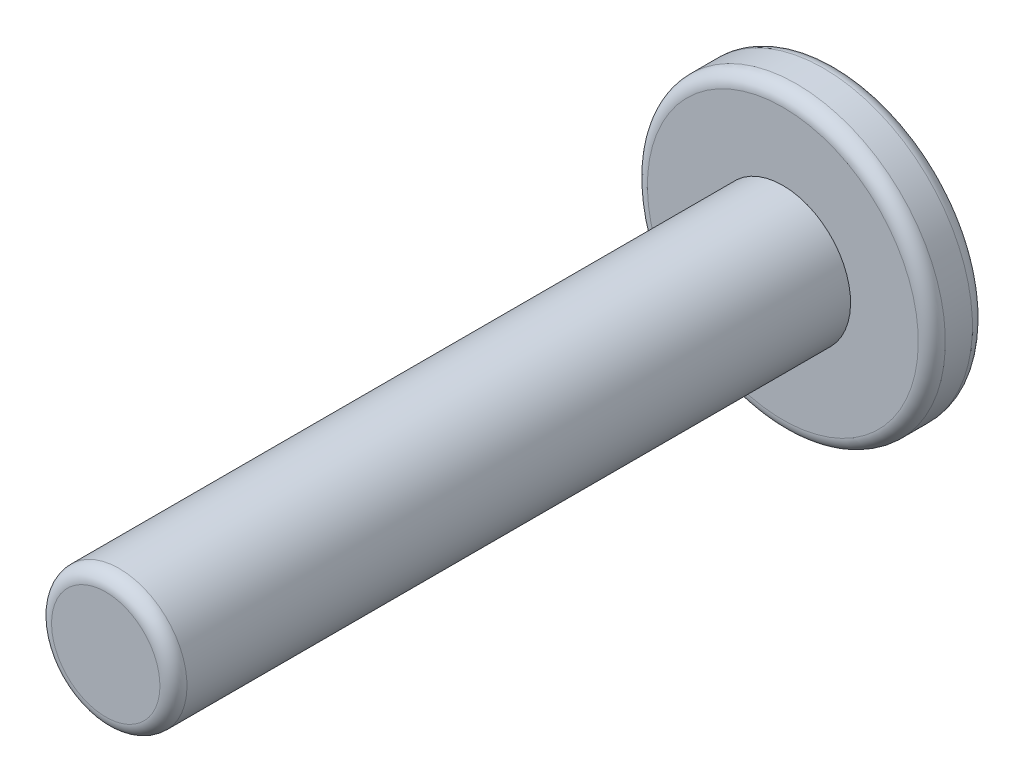
ISO-10303-21;
HEADER;
FILE_DESCRIPTION(('STEP AP214'),'2;1');
FILE_NAME('part.step','',(''),(''),'','','');
FILE_SCHEMA(('AUTOMOTIVE_DESIGN { 1 0 10303 214 1 1 1 1 }'));
ENDSEC;
DATA;
#1=APPLICATION_CONTEXT('core data for automotive mechanical design processes');
#2=APPLICATION_PROTOCOL_DEFINITION('international standard','automotive_design',2000,#1);
#3=PRODUCT_CONTEXT('',#1,'mechanical');
#4=PRODUCT('Part','Part','',(#3));
#5=PRODUCT_RELATED_PRODUCT_CATEGORY('part','',(#4));
#6=PRODUCT_DEFINITION_FORMATION('','',#4);
#7=PRODUCT_DEFINITION_CONTEXT('part definition',#1,'design');
#8=PRODUCT_DEFINITION('design','',#6,#7);
#9=PRODUCT_DEFINITION_SHAPE('','',#8);
#10=(LENGTH_UNIT() NAMED_UNIT(*) SI_UNIT(.MILLI.,.METRE.));
#11=(NAMED_UNIT(*) PLANE_ANGLE_UNIT() SI_UNIT($,.RADIAN.));
#12=(NAMED_UNIT(*) SI_UNIT($,.STERADIAN.) SOLID_ANGLE_UNIT());
#13=UNCERTAINTY_MEASURE_WITH_UNIT(LENGTH_MEASURE(1.E-05),#10,'distance_accuracy_value','');
#14=(GEOMETRIC_REPRESENTATION_CONTEXT(3) GLOBAL_UNCERTAINTY_ASSIGNED_CONTEXT((#13)) GLOBAL_UNIT_ASSIGNED_CONTEXT((#10,
#11,#12)) REPRESENTATION_CONTEXT('',''));
#15=CARTESIAN_POINT('',(0.,0.,0.));
#16=DIRECTION('',(0.,0.,1.));
#17=DIRECTION('',(1.,0.,0.));
#18=AXIS2_PLACEMENT_3D('',#15,#16,#17);
#19=CARTESIAN_POINT('',(0.,0.,0.));
#20=DIRECTION('',(0.,0.,-1.));
#21=DIRECTION('',(-1.,0.,0.));
#22=AXIS2_PLACEMENT_3D('',#19,#20,#21);
#23=PLANE('',#22);
#24=CARTESIAN_POINT('',(0.,0.,0.));
#25=DIRECTION('',(0.,0.,1.));
#26=DIRECTION('',(0.,-1.,0.));
#27=AXIS2_PLACEMENT_3D('',#24,#25,#26);
#28=CIRCLE('',#27,5.);
#29=CARTESIAN_POINT('',(0.,5.,0.));
#30=VERTEX_POINT('',#29);
#31=EDGE_CURVE('E11',#30,#30,#28,.T.);
#32=ORIENTED_EDGE('',*,*,#31,.F.);
#33=EDGE_LOOP('',(#32));
#34=FACE_BOUND('',#33,.T.);
#35=DIRECTION('',(0.,-1.,0.));
#36=VECTOR('',#35,1.);
#37=CARTESIAN_POINT('',(-1.5,0.433012701892219,0.));
#38=LINE('',#37,#36);
#39=CARTESIAN_POINT('',(-1.5,0.866025403784438,0.));
#40=VERTEX_POINT('',#39);
#41=CARTESIAN_POINT('',(-1.5,-0.866025403784438,0.));
#42=VERTEX_POINT('',#41);
#43=EDGE_CURVE('E114',#40,#42,#38,.T.);
#44=ORIENTED_EDGE('',*,*,#43,.T.);
#45=DIRECTION('',(0.866025403784439,-0.5,0.));
#46=VECTOR('',#45,1.);
#47=CARTESIAN_POINT('',(-1.125,-1.08253175473055,0.));
#48=LINE('',#47,#46);
#49=CARTESIAN_POINT('',(0.,-1.73205080756888,0.));
#50=VERTEX_POINT('',#49);
#51=EDGE_CURVE('E166',#42,#50,#48,.T.);
#52=ORIENTED_EDGE('',*,*,#51,.T.);
#53=DIRECTION('',(0.866025403784439,0.5,0.));
#54=VECTOR('',#53,1.);
#55=CARTESIAN_POINT('',(0.375,-1.51554445662277,0.));
#56=LINE('',#55,#54);
#57=CARTESIAN_POINT('',(1.5,-0.866025403784438,0.));
#58=VERTEX_POINT('',#57);
#59=EDGE_CURVE('E156',#50,#58,#56,.T.);
#60=ORIENTED_EDGE('',*,*,#59,.T.);
#61=DIRECTION('',(0.,1.,0.));
#62=VECTOR('',#61,1.);
#63=CARTESIAN_POINT('',(1.5,-0.433012701892219,0.));
#64=LINE('',#63,#62);
#65=CARTESIAN_POINT('',(1.5,0.866025403784438,0.));
#66=VERTEX_POINT('',#65);
#67=EDGE_CURVE('E161',#58,#66,#64,.T.);
#68=ORIENTED_EDGE('',*,*,#67,.T.);
#69=DIRECTION('',(-0.866025403784439,0.5,0.));
#70=VECTOR('',#69,1.);
#71=CARTESIAN_POINT('',(1.125,1.08253175473055,0.));
#72=LINE('',#71,#70);
#73=CARTESIAN_POINT('',(0.,1.73205080756887,0.));
#74=VERTEX_POINT('',#73);
#75=EDGE_CURVE('E116',#66,#74,#72,.T.);
#76=ORIENTED_EDGE('',*,*,#75,.T.);
#77=DIRECTION('',(-0.866025403784439,-0.5,0.));
#78=VECTOR('',#77,1.);
#79=CARTESIAN_POINT('',(-0.375,1.51554445662277,0.));
#80=LINE('',#79,#78);
#81=EDGE_CURVE('E111',#74,#40,#80,.T.);
#82=ORIENTED_EDGE('',*,*,#81,.T.);
#83=EDGE_LOOP('',(#44,#52,#60,#68,#76,#82));
#84=FACE_BOUND('',#83,.T.);
#85=ADVANCED_FACE('F17',(#34,#84),#23,.T.);
#86=CARTESIAN_POINT('',(0.,0.,0.5));
#87=DIRECTION('',(0.,0.,-1.));
#88=DIRECTION('',(-1.,0.,0.));
#89=AXIS2_PLACEMENT_3D('',#86,#87,#88);
#90=TOROIDAL_SURFACE('',#89,5.,0.5);
#91=ORIENTED_EDGE('',*,*,#31,.T.);
#92=EDGE_LOOP('',(#91));
#93=FACE_BOUND('',#92,.T.);
#94=CARTESIAN_POINT('',(0.,0.,0.5));
#95=DIRECTION('',(0.,0.,-1.));
#96=DIRECTION('',(0.,-1.,0.));
#97=AXIS2_PLACEMENT_3D('',#94,#95,#96);
#98=CIRCLE('',#97,5.5);
#99=CARTESIAN_POINT('',(0.,5.5,0.5));
#100=VERTEX_POINT('',#99);
#101=EDGE_CURVE('E25',#100,#100,#98,.T.);
#102=ORIENTED_EDGE('',*,*,#101,.T.);
#103=EDGE_LOOP('',(#102));
#104=FACE_BOUND('',#103,.T.);
#105=ADVANCED_FACE('F244',(#93,#104),#90,.T.);
#106=CARTESIAN_POINT('',(0.,5.5,2.));
#107=DIRECTION('',(0.,0.,1.));
#108=DIRECTION('',(0.,-1.,0.));
#109=AXIS2_PLACEMENT_3D('',#106,#107,#108);
#110=PLANE('',#109);
#111=CARTESIAN_POINT('',(0.,0.,2.));
#112=DIRECTION('',(0.,0.,-1.));
#113=DIRECTION('',(0.,-1.,0.));
#114=AXIS2_PLACEMENT_3D('',#111,#112,#113);
#115=CIRCLE('',#114,5.);
#116=CARTESIAN_POINT('',(0.,5.,2.));
#117=VERTEX_POINT('',#116);
#118=EDGE_CURVE('E194',#117,#117,#115,.T.);
#119=ORIENTED_EDGE('',*,*,#118,.F.);
#120=EDGE_LOOP('',(#119));
#121=FACE_BOUND('',#120,.T.);
#122=CARTESIAN_POINT('',(0.,0.,2.));
#123=DIRECTION('',(0.,0.,-1.));
#124=DIRECTION('',(1.,0.,0.));
#125=AXIS2_PLACEMENT_3D('',#122,#123,#124);
#126=CIRCLE('',#125,2.5);
#127=CARTESIAN_POINT('',(0.,2.5,2.));
#128=VERTEX_POINT('',#127);
#129=EDGE_CURVE('E191',#128,#128,#126,.T.);
#130=ORIENTED_EDGE('',*,*,#129,.T.);
#131=EDGE_LOOP('',(#130));
#132=FACE_BOUND('',#131,.T.);
#133=ADVANCED_FACE('F240',(#121,#132),#110,.T.);
#134=CARTESIAN_POINT('',(0.,0.,1.));
#135=DIRECTION('',(0.,0.,-1.));
#136=DIRECTION('',(0.,1.,0.));
#137=AXIS2_PLACEMENT_3D('',#134,#135,#136);
#138=CYLINDRICAL_SURFACE('',#137,5.5);
#139=CARTESIAN_POINT('',(0.,0.,1.5));
#140=DIRECTION('',(0.,0.,1.));
#141=DIRECTION('',(0.,-1.,0.));
#142=AXIS2_PLACEMENT_3D('',#139,#140,#141);
#143=CIRCLE('',#142,5.5);
#144=CARTESIAN_POINT('',(0.,5.5,1.5));
#145=VERTEX_POINT('',#144);
#146=EDGE_CURVE('E197',#145,#145,#143,.T.);
#147=ORIENTED_EDGE('',*,*,#146,.F.);
#148=EDGE_LOOP('',(#147));
#149=FACE_BOUND('',#148,.T.);
#150=ORIENTED_EDGE('',*,*,#101,.F.);
#151=EDGE_LOOP('',(#150));
#152=FACE_BOUND('',#151,.T.);
#153=ADVANCED_FACE('F212',(#149,#152),#138,.T.);
#154=CARTESIAN_POINT('',(0.,0.,1.5));
#155=DIRECTION('',(0.,0.,-1.));
#156=DIRECTION('',(-1.,0.,0.));
#157=AXIS2_PLACEMENT_3D('',#154,#155,#156);
#158=TOROIDAL_SURFACE('',#157,5.,0.5);
#159=ORIENTED_EDGE('',*,*,#146,.T.);
#160=EDGE_LOOP('',(#159));
#161=FACE_BOUND('',#160,.T.);
#162=ORIENTED_EDGE('',*,*,#118,.T.);
#163=EDGE_LOOP('',(#162));
#164=FACE_BOUND('',#163,.T.);
#165=ADVANCED_FACE('F206',(#161,#164),#158,.T.);
#166=CARTESIAN_POINT('',(0.,0.,14.5));
#167=DIRECTION('',(0.,0.,-1.));
#168=DIRECTION('',(0.,1.,0.));
#169=AXIS2_PLACEMENT_3D('',#166,#167,#168);
#170=CYLINDRICAL_SURFACE('',#169,2.5);
#171=CARTESIAN_POINT('',(0.,0.,26.5));
#172=DIRECTION('',(0.,0.,1.));
#173=DIRECTION('',(0.,-1.,0.));
#174=AXIS2_PLACEMENT_3D('',#171,#172,#173);
#175=CIRCLE('',#174,2.5);
#176=CARTESIAN_POINT('',(0.,2.5,26.5));
#177=VERTEX_POINT('',#176);
#178=EDGE_CURVE('E170',#177,#177,#175,.T.);
#179=ORIENTED_EDGE('',*,*,#178,.F.);
#180=EDGE_LOOP('',(#179));
#181=FACE_BOUND('',#180,.T.);
#182=ORIENTED_EDGE('',*,*,#129,.F.);
#183=EDGE_LOOP('',(#182));
#184=FACE_BOUND('',#183,.T.);
#185=ADVANCED_FACE('F211',(#181,#184),#170,.T.);
#186=CARTESIAN_POINT('',(0.,2.5,27.));
#187=DIRECTION('',(0.,0.,1.));
#188=DIRECTION('',(0.,-1.,0.));
#189=AXIS2_PLACEMENT_3D('',#186,#187,#188);
#190=PLANE('',#189);
#191=CARTESIAN_POINT('',(0.,0.,27.));
#192=DIRECTION('',(0.,0.,-1.));
#193=DIRECTION('',(0.,-1.,0.));
#194=AXIS2_PLACEMENT_3D('',#191,#192,#193);
#195=CIRCLE('',#194,2.);
#196=CARTESIAN_POINT('',(0.,2.,27.));
#197=VERTEX_POINT('',#196);
#198=EDGE_CURVE('E167',#197,#197,#195,.T.);
#199=ORIENTED_EDGE('',*,*,#198,.F.);
#200=EDGE_LOOP('',(#199));
#201=FACE_BOUND('',#200,.T.);
#202=ADVANCED_FACE('F218',(#201),#190,.T.);
#203=CARTESIAN_POINT('',(0.,0.,26.5));
#204=DIRECTION('',(0.,0.,-1.));
#205=DIRECTION('',(-1.,0.,0.));
#206=AXIS2_PLACEMENT_3D('',#203,#204,#205);
#207=TOROIDAL_SURFACE('',#206,2.,0.5);
#208=ORIENTED_EDGE('',*,*,#178,.T.);
#209=EDGE_LOOP('',(#208));
#210=FACE_BOUND('',#209,.T.);
#211=ORIENTED_EDGE('',*,*,#198,.T.);
#212=EDGE_LOOP('',(#211));
#213=FACE_BOUND('',#212,.T.);
#214=ADVANCED_FACE('F222',(#210,#213),#207,.T.);
#215=CARTESIAN_POINT('',(0.,0.,3.));
#216=DIRECTION('',(0.,0.,1.));
#217=DIRECTION('',(0.,-1.,0.));
#218=AXIS2_PLACEMENT_3D('',#215,#216,#217);
#219=PLANE('',#218);
#220=DIRECTION('',(0.866025403784439,-0.5,0.));
#221=VECTOR('',#220,1.);
#222=CARTESIAN_POINT('',(-1.5,-0.86602540378444,3.));
#223=LINE('',#222,#221);
#224=CARTESIAN_POINT('',(-1.5,-0.86602540378444,3.));
#225=VERTEX_POINT('',#224);
#226=CARTESIAN_POINT('',(0.,-1.73205080756888,3.));
#227=VERTEX_POINT('',#226);
#228=EDGE_CURVE('E171',#225,#227,#223,.T.);
#229=ORIENTED_EDGE('',*,*,#228,.F.);
#230=DIRECTION('',(0.,-1.,0.));
#231=VECTOR('',#230,1.);
#232=CARTESIAN_POINT('',(-1.5,0.866025403784438,3.));
#233=LINE('',#232,#231);
#234=CARTESIAN_POINT('',(-1.5,0.866025403784438,3.));
#235=VERTEX_POINT('',#234);
#236=EDGE_CURVE('E133',#235,#225,#233,.T.);
#237=ORIENTED_EDGE('',*,*,#236,.F.);
#238=DIRECTION('',(-0.866025403784439,-0.5,0.));
#239=VECTOR('',#238,1.);
#240=CARTESIAN_POINT('',(0.,1.73205080756887,3.));
#241=LINE('',#240,#239);
#242=CARTESIAN_POINT('',(0.,1.73205080756887,3.));
#243=VERTEX_POINT('',#242);
#244=EDGE_CURVE('E128',#243,#235,#241,.T.);
#245=ORIENTED_EDGE('',*,*,#244,.F.);
#246=DIRECTION('',(-0.866025403784439,0.5,0.));
#247=VECTOR('',#246,1.);
#248=CARTESIAN_POINT('',(1.5,0.866025403784438,3.));
#249=LINE('',#248,#247);
#250=CARTESIAN_POINT('',(1.5,0.866025403784438,3.));
#251=VERTEX_POINT('',#250);
#252=EDGE_CURVE('E150',#251,#243,#249,.T.);
#253=ORIENTED_EDGE('',*,*,#252,.F.);
#254=DIRECTION('',(0.,1.,0.));
#255=VECTOR('',#254,1.);
#256=CARTESIAN_POINT('',(1.5,-0.86602540378444,3.));
#257=LINE('',#256,#255);
#258=CARTESIAN_POINT('',(1.5,-0.86602540378444,3.));
#259=VERTEX_POINT('',#258);
#260=EDGE_CURVE('E174',#259,#251,#257,.T.);
#261=ORIENTED_EDGE('',*,*,#260,.F.);
#262=DIRECTION('',(0.866025403784439,0.5,0.));
#263=VECTOR('',#262,1.);
#264=CARTESIAN_POINT('',(0.,-1.73205080756888,3.));
#265=LINE('',#264,#263);
#266=EDGE_CURVE('E155',#227,#259,#265,.T.);
#267=ORIENTED_EDGE('',*,*,#266,.F.);
#268=EDGE_LOOP('',(#229,#237,#245,#253,#261,#267));
#269=FACE_BOUND('',#268,.T.);
#270=ADVANCED_FACE('F260',(#269),#219,.F.);
#271=CARTESIAN_POINT('',(-1.5,-0.866025403784438,0.));
#272=DIRECTION('',(-0.5,-0.866025403784439,0.));
#273=DIRECTION('',(-0.866025403784439,0.5,0.));
#274=AXIS2_PLACEMENT_3D('',#271,#272,#273);
#275=PLANE('',#274);
#276=ORIENTED_EDGE('',*,*,#51,.F.);
#277=DIRECTION('',(0.,0.,1.));
#278=VECTOR('',#277,1.);
#279=CARTESIAN_POINT('',(-1.5,-0.866025403784438,0.));
#280=LINE('',#279,#278);
#281=EDGE_CURVE('E122',#42,#225,#280,.T.);
#282=ORIENTED_EDGE('',*,*,#281,.T.);
#283=ORIENTED_EDGE('',*,*,#228,.T.);
#284=DIRECTION('',(0.,0.,1.));
#285=VECTOR('',#284,1.);
#286=CARTESIAN_POINT('',(0.,-1.73205080756888,0.));
#287=LINE('',#286,#285);
#288=EDGE_CURVE('E151',#50,#227,#287,.T.);
#289=ORIENTED_EDGE('',*,*,#288,.F.);
#290=EDGE_LOOP('',(#276,#282,#283,#289));
#291=FACE_BOUND('',#290,.T.);
#292=ADVANCED_FACE('F283',(#291),#275,.F.);
#293=CARTESIAN_POINT('',(0.,-1.73205080756888,0.));
#294=DIRECTION('',(0.5,-0.866025403784439,0.));
#295=DIRECTION('',(0.,0.,-1.));
#296=AXIS2_PLACEMENT_3D('',#293,#294,#295);
#297=PLANE('',#296);
#298=ORIENTED_EDGE('',*,*,#59,.F.);
#299=ORIENTED_EDGE('',*,*,#288,.T.);
#300=ORIENTED_EDGE('',*,*,#266,.T.);
#301=DIRECTION('',(0.,0.,1.));
#302=VECTOR('',#301,1.);
#303=CARTESIAN_POINT('',(1.5,-0.866025403784438,0.));
#304=LINE('',#303,#302);
#305=EDGE_CURVE('E177',#58,#259,#304,.T.);
#306=ORIENTED_EDGE('',*,*,#305,.F.);
#307=EDGE_LOOP('',(#298,#299,#300,#306));
#308=FACE_BOUND('',#307,.T.);
#309=ADVANCED_FACE('F268',(#308),#297,.F.);
#310=CARTESIAN_POINT('',(1.5,-0.866025403784438,0.));
#311=DIRECTION('',(1.,0.,0.));
#312=DIRECTION('',(0.,1.,0.));
#313=AXIS2_PLACEMENT_3D('',#310,#311,#312);
#314=PLANE('',#313);
#315=ORIENTED_EDGE('',*,*,#67,.F.);
#316=ORIENTED_EDGE('',*,*,#305,.T.);
#317=ORIENTED_EDGE('',*,*,#260,.T.);
#318=DIRECTION('',(0.,0.,1.));
#319=VECTOR('',#318,1.);
#320=CARTESIAN_POINT('',(1.5,0.866025403784438,0.));
#321=LINE('',#320,#319);
#322=EDGE_CURVE('E143',#66,#251,#321,.T.);
#323=ORIENTED_EDGE('',*,*,#322,.F.);
#324=EDGE_LOOP('',(#315,#316,#317,#323));
#325=FACE_BOUND('',#324,.T.);
#326=ADVANCED_FACE('F252',(#325),#314,.F.);
#327=CARTESIAN_POINT('',(1.5,0.866025403784438,0.));
#328=DIRECTION('',(0.5,0.866025403784439,0.));
#329=DIRECTION('',(0.,0.,-1.));
#330=AXIS2_PLACEMENT_3D('',#327,#328,#329);
#331=PLANE('',#330);
#332=ORIENTED_EDGE('',*,*,#75,.F.);
#333=ORIENTED_EDGE('',*,*,#322,.T.);
#334=ORIENTED_EDGE('',*,*,#252,.T.);
#335=DIRECTION('',(0.,0.,1.));
#336=VECTOR('',#335,1.);
#337=CARTESIAN_POINT('',(0.,1.73205080756887,0.));
#338=LINE('',#337,#336);
#339=EDGE_CURVE('E121',#74,#243,#338,.T.);
#340=ORIENTED_EDGE('',*,*,#339,.F.);
#341=EDGE_LOOP('',(#332,#333,#334,#340));
#342=FACE_BOUND('',#341,.T.);
#343=ADVANCED_FACE('F236',(#342),#331,.F.);
#344=CARTESIAN_POINT('',(0.,1.73205080756887,0.));
#345=DIRECTION('',(-0.5,0.866025403784439,0.));
#346=DIRECTION('',(0.,0.,1.));
#347=AXIS2_PLACEMENT_3D('',#344,#345,#346);
#348=PLANE('',#347);
#349=ORIENTED_EDGE('',*,*,#81,.F.);
#350=ORIENTED_EDGE('',*,*,#339,.T.);
#351=ORIENTED_EDGE('',*,*,#244,.T.);
#352=DIRECTION('',(0.,0.,1.));
#353=VECTOR('',#352,1.);
#354=CARTESIAN_POINT('',(-1.5,0.866025403784438,0.));
#355=LINE('',#354,#353);
#356=EDGE_CURVE('E125',#40,#235,#355,.T.);
#357=ORIENTED_EDGE('',*,*,#356,.F.);
#358=EDGE_LOOP('',(#349,#350,#351,#357));
#359=FACE_BOUND('',#358,.T.);
#360=ADVANCED_FACE('F126',(#359),#348,.F.);
#361=CARTESIAN_POINT('',(-1.5,0.866025403784438,0.));
#362=DIRECTION('',(-1.,0.,0.));
#363=DIRECTION('',(0.,1.,0.));
#364=AXIS2_PLACEMENT_3D('',#361,#362,#363);
#365=PLANE('',#364);
#366=ORIENTED_EDGE('',*,*,#43,.F.);
#367=ORIENTED_EDGE('',*,*,#356,.T.);
#368=ORIENTED_EDGE('',*,*,#236,.T.);
#369=ORIENTED_EDGE('',*,*,#281,.F.);
#370=EDGE_LOOP('',(#366,#367,#368,#369));
#371=FACE_BOUND('',#370,.T.);
#372=ADVANCED_FACE('F136',(#371),#365,.F.);
#373=CLOSED_SHELL('',(#85,#105,#133,#153,#165,#185,#202,#214,#270,#292,#309,#326,#343,#360,#372));
#374=MANIFOLD_SOLID_BREP('B1',#373);
#375=ADVANCED_BREP_SHAPE_REPRESENTATION('',(#18,#374),#14);
#376=SHAPE_DEFINITION_REPRESENTATION(#9,#375);
ENDSEC;
END-ISO-10303-21;
